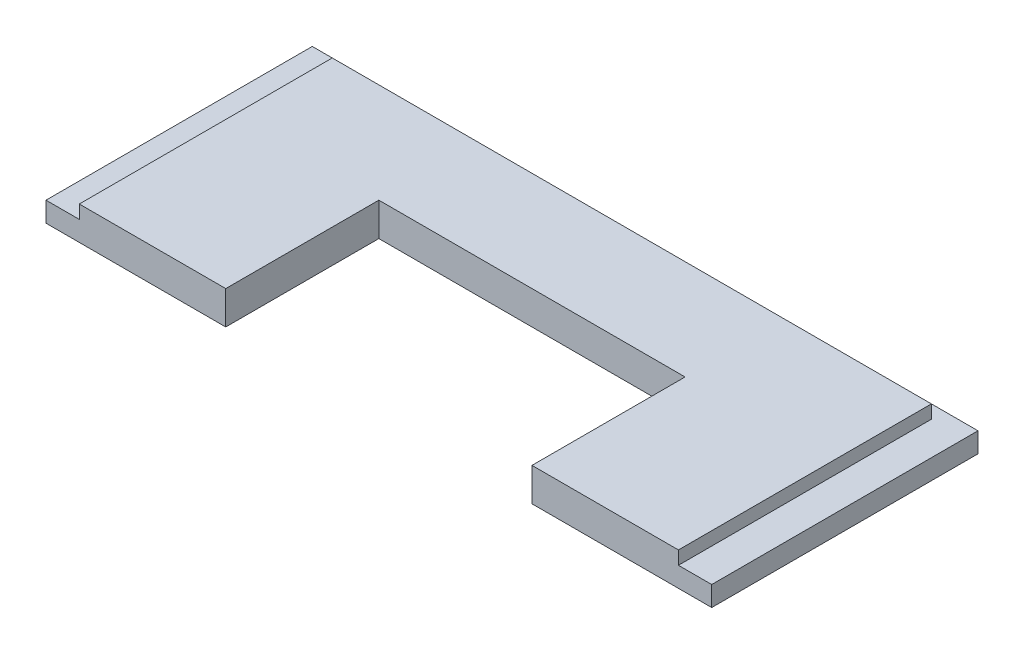
ISO-10303-21;
HEADER;
FILE_DESCRIPTION(('STEP AP214'),'2;1');
FILE_NAME('part.step','',(''),(''),'','','');
FILE_SCHEMA(('AUTOMOTIVE_DESIGN { 1 0 10303 214 1 1 1 1 }'));
ENDSEC;
DATA;
#1=APPLICATION_CONTEXT('core data for automotive mechanical design processes');
#2=APPLICATION_PROTOCOL_DEFINITION('international standard','automotive_design',2000,#1);
#3=PRODUCT_CONTEXT('',#1,'mechanical');
#4=PRODUCT('Part','Part','',(#3));
#5=PRODUCT_RELATED_PRODUCT_CATEGORY('part','',(#4));
#6=PRODUCT_DEFINITION_FORMATION('','',#4);
#7=PRODUCT_DEFINITION_CONTEXT('part definition',#1,'design');
#8=PRODUCT_DEFINITION('design','',#6,#7);
#9=PRODUCT_DEFINITION_SHAPE('','',#8);
#10=(LENGTH_UNIT() NAMED_UNIT(*) SI_UNIT(.MILLI.,.METRE.));
#11=(NAMED_UNIT(*) PLANE_ANGLE_UNIT() SI_UNIT($,.RADIAN.));
#12=(NAMED_UNIT(*) SI_UNIT($,.STERADIAN.) SOLID_ANGLE_UNIT());
#13=UNCERTAINTY_MEASURE_WITH_UNIT(LENGTH_MEASURE(1.E-05),#10,'distance_accuracy_value','');
#14=(GEOMETRIC_REPRESENTATION_CONTEXT(3) GLOBAL_UNCERTAINTY_ASSIGNED_CONTEXT((#13)) GLOBAL_UNIT_ASSIGNED_CONTEXT((#10,
#11,#12)) REPRESENTATION_CONTEXT('',''));
#15=CARTESIAN_POINT('',(0.,0.,0.));
#16=DIRECTION('',(0.,0.,1.));
#17=DIRECTION('',(1.,0.,0.));
#18=AXIS2_PLACEMENT_3D('',#15,#16,#17);
#19=CARTESIAN_POINT('',(0.,5.,0.));
#20=DIRECTION('',(0.,0.,1.));
#21=DIRECTION('',(1.,0.,0.));
#22=AXIS2_PLACEMENT_3D('',#19,#20,#21);
#23=PLANE('',#22);
#24=DIRECTION('',(1.,0.,0.));
#25=VECTOR('',#24,1.);
#26=CARTESIAN_POINT('',(0.,3.,0.));
#27=LINE('',#26,#25);
#28=CARTESIAN_POINT('',(-5.,3.,0.));
#29=VERTEX_POINT('',#28);
#30=CARTESIAN_POINT('',(0.,3.,0.));
#31=VERTEX_POINT('',#30);
#32=EDGE_CURVE('E232',#29,#31,#27,.T.);
#33=ORIENTED_EDGE('',*,*,#32,.F.);
#34=DIRECTION('',(0.,1.,0.));
#35=VECTOR('',#34,1.);
#36=CARTESIAN_POINT('',(-5.,3.,0.));
#37=LINE('',#36,#35);
#38=CARTESIAN_POINT('',(-5.,5.,0.));
#39=VERTEX_POINT('',#38);
#40=EDGE_CURVE('E175',#29,#39,#37,.T.);
#41=ORIENTED_EDGE('',*,*,#40,.T.);
#42=DIRECTION('',(-1.,0.,0.));
#43=VECTOR('',#42,1.);
#44=CARTESIAN_POINT('',(0.,5.,0.));
#45=LINE('',#44,#43);
#46=CARTESIAN_POINT('',(-27.,5.,0.));
#47=VERTEX_POINT('',#46);
#48=EDGE_CURVE('E100',#39,#47,#45,.T.);
#49=ORIENTED_EDGE('',*,*,#48,.T.);
#50=DIRECTION('',(0.,-1.,0.));
#51=VECTOR('',#50,1.);
#52=CARTESIAN_POINT('',(-27.,5.,0.));
#53=LINE('',#52,#51);
#54=CARTESIAN_POINT('',(-27.,0.,0.));
#55=VERTEX_POINT('',#54);
#56=EDGE_CURVE('E11',#47,#55,#53,.T.);
#57=ORIENTED_EDGE('',*,*,#56,.T.);
#58=DIRECTION('',(-1.,0.,0.));
#59=VECTOR('',#58,1.);
#60=CARTESIAN_POINT('',(0.,0.,0.));
#61=LINE('',#60,#59);
#62=CARTESIAN_POINT('',(0.,0.,0.));
#63=VERTEX_POINT('',#62);
#64=EDGE_CURVE('E174',#63,#55,#61,.T.);
#65=ORIENTED_EDGE('',*,*,#64,.F.);
#66=DIRECTION('',(0.,-1.,0.));
#67=VECTOR('',#66,1.);
#68=CARTESIAN_POINT('',(0.,5.,0.));
#69=LINE('',#68,#67);
#70=EDGE_CURVE('E45',#31,#63,#69,.T.);
#71=ORIENTED_EDGE('',*,*,#70,.F.);
#72=EDGE_LOOP('',(#33,#41,#49,#57,#65,#71));
#73=FACE_BOUND('',#72,.T.);
#74=ADVANCED_FACE('F37',(#73),#23,.T.);
#75=CARTESIAN_POINT('',(0.,5.,0.));
#76=DIRECTION('',(-1.,0.,0.));
#77=DIRECTION('',(0.,0.,1.));
#78=AXIS2_PLACEMENT_3D('',#75,#76,#77);
#79=PLANE('',#78);
#80=DIRECTION('',(0.,0.,-1.));
#81=VECTOR('',#80,1.);
#82=CARTESIAN_POINT('',(0.,3.,0.));
#83=LINE('',#82,#81);
#84=CARTESIAN_POINT('',(0.,3.,-40.));
#85=VERTEX_POINT('',#84);
#86=EDGE_CURVE('E209',#31,#85,#83,.T.);
#87=ORIENTED_EDGE('',*,*,#86,.F.);
#88=ORIENTED_EDGE('',*,*,#70,.T.);
#89=DIRECTION('',(0.,0.,-1.));
#90=VECTOR('',#89,1.);
#91=CARTESIAN_POINT('',(0.,0.,0.));
#92=LINE('',#91,#90);
#93=CARTESIAN_POINT('',(0.,0.,-40.));
#94=VERTEX_POINT('',#93);
#95=EDGE_CURVE('E178',#63,#94,#92,.T.);
#96=ORIENTED_EDGE('',*,*,#95,.T.);
#97=DIRECTION('',(0.,-1.,0.));
#98=VECTOR('',#97,1.);
#99=CARTESIAN_POINT('',(0.,5.,-40.));
#100=LINE('',#99,#98);
#101=EDGE_CURVE('E201',#85,#94,#100,.T.);
#102=ORIENTED_EDGE('',*,*,#101,.F.);
#103=EDGE_LOOP('',(#87,#88,#96,#102));
#104=FACE_BOUND('',#103,.T.);
#105=ADVANCED_FACE('F206',(#104),#79,.F.);
#106=CARTESIAN_POINT('',(0.,5.,-40.));
#107=DIRECTION('',(0.,0.,1.));
#108=DIRECTION('',(1.,0.,0.));
#109=AXIS2_PLACEMENT_3D('',#106,#107,#108);
#110=PLANE('',#109);
#111=DIRECTION('',(-1.,0.,0.));
#112=VECTOR('',#111,1.);
#113=CARTESIAN_POINT('',(0.,3.,-40.));
#114=LINE('',#113,#112);
#115=CARTESIAN_POINT('',(-100.,3.,-40.));
#116=VERTEX_POINT('',#115);
#117=EDGE_CURVE('E160',#85,#116,#114,.T.);
#118=ORIENTED_EDGE('',*,*,#117,.F.);
#119=ORIENTED_EDGE('',*,*,#101,.T.);
#120=DIRECTION('',(-1.,0.,0.));
#121=VECTOR('',#120,1.);
#122=CARTESIAN_POINT('',(0.,0.,-40.));
#123=LINE('',#122,#121);
#124=CARTESIAN_POINT('',(-100.,0.,-40.));
#125=VERTEX_POINT('',#124);
#126=EDGE_CURVE('E182',#94,#125,#123,.T.);
#127=ORIENTED_EDGE('',*,*,#126,.T.);
#128=DIRECTION('',(0.,-1.,0.));
#129=VECTOR('',#128,1.);
#130=CARTESIAN_POINT('',(-100.,5.,-40.));
#131=LINE('',#130,#129);
#132=EDGE_CURVE('E199',#116,#125,#131,.T.);
#133=ORIENTED_EDGE('',*,*,#132,.F.);
#134=EDGE_LOOP('',(#118,#119,#127,#133));
#135=FACE_BOUND('',#134,.T.);
#136=ADVANCED_FACE('F230',(#135),#110,.F.);
#137=CARTESIAN_POINT('',(-100.,5.,0.));
#138=DIRECTION('',(-1.,0.,0.));
#139=DIRECTION('',(0.,0.,1.));
#140=AXIS2_PLACEMENT_3D('',#137,#138,#139);
#141=PLANE('',#140);
#142=DIRECTION('',(0.,-1.,0.));
#143=VECTOR('',#142,1.);
#144=CARTESIAN_POINT('',(-100.,5.,0.));
#145=LINE('',#144,#143);
#146=CARTESIAN_POINT('',(-100.,3.,0.));
#147=VERTEX_POINT('',#146);
#148=CARTESIAN_POINT('',(-100.,0.,0.));
#149=VERTEX_POINT('',#148);
#150=EDGE_CURVE('E197',#147,#149,#145,.T.);
#151=ORIENTED_EDGE('',*,*,#150,.F.);
#152=DIRECTION('',(0.,0.,1.));
#153=VECTOR('',#152,1.);
#154=CARTESIAN_POINT('',(-100.,3.,0.));
#155=LINE('',#154,#153);
#156=EDGE_CURVE('E148',#116,#147,#155,.T.);
#157=ORIENTED_EDGE('',*,*,#156,.F.);
#158=ORIENTED_EDGE('',*,*,#132,.T.);
#159=DIRECTION('',(0.,0.,-1.));
#160=VECTOR('',#159,1.);
#161=CARTESIAN_POINT('',(-100.,0.,0.));
#162=LINE('',#161,#160);
#163=EDGE_CURVE('E185',#149,#125,#162,.T.);
#164=ORIENTED_EDGE('',*,*,#163,.F.);
#165=EDGE_LOOP('',(#151,#157,#158,#164));
#166=FACE_BOUND('',#165,.T.);
#167=ADVANCED_FACE('F226',(#166),#141,.T.);
#168=CARTESIAN_POINT('',(0.,5.,0.));
#169=DIRECTION('',(0.,1.,0.));
#170=DIRECTION('',(0.,0.,1.));
#171=AXIS2_PLACEMENT_3D('',#168,#169,#170);
#172=PLANE('',#171);
#173=ORIENTED_EDGE('',*,*,#48,.F.);
#174=DIRECTION('',(0.,0.,-1.));
#175=VECTOR('',#174,1.);
#176=CARTESIAN_POINT('',(-5.,5.,0.));
#177=LINE('',#176,#175);
#178=CARTESIAN_POINT('',(-5.,5.,-38.));
#179=VERTEX_POINT('',#178);
#180=EDGE_CURVE('E151',#39,#179,#177,.T.);
#181=ORIENTED_EDGE('',*,*,#180,.T.);
#182=DIRECTION('',(1.,0.,0.));
#183=VECTOR('',#182,1.);
#184=CARTESIAN_POINT('',(0.,5.,-38.));
#185=LINE('',#184,#183);
#186=CARTESIAN_POINT('',(-95.,5.,-38.));
#187=VERTEX_POINT('',#186);
#188=EDGE_CURVE('E238',#187,#179,#185,.T.);
#189=ORIENTED_EDGE('',*,*,#188,.F.);
#190=DIRECTION('',(0.,0.,-1.));
#191=VECTOR('',#190,1.);
#192=CARTESIAN_POINT('',(-95.,5.,0.));
#193=LINE('',#192,#191);
#194=CARTESIAN_POINT('',(-95.,5.,0.));
#195=VERTEX_POINT('',#194);
#196=EDGE_CURVE('E236',#195,#187,#193,.T.);
#197=ORIENTED_EDGE('',*,*,#196,.F.);
#198=CARTESIAN_POINT('',(-73.,5.,0.));
#199=VERTEX_POINT('',#198);
#200=EDGE_CURVE('E156',#199,#195,#45,.T.);
#201=ORIENTED_EDGE('',*,*,#200,.F.);
#202=DIRECTION('',(0.,0.,-1.));
#203=VECTOR('',#202,1.);
#204=CARTESIAN_POINT('',(-73.,5.,0.));
#205=LINE('',#204,#203);
#206=CARTESIAN_POINT('',(-73.,5.,-23.));
#207=VERTEX_POINT('',#206);
#208=EDGE_CURVE('E168',#199,#207,#205,.T.);
#209=ORIENTED_EDGE('',*,*,#208,.T.);
#210=DIRECTION('',(1.,0.,0.));
#211=VECTOR('',#210,1.);
#212=CARTESIAN_POINT('',(0.,5.,-23.));
#213=LINE('',#212,#211);
#214=CARTESIAN_POINT('',(-27.,5.,-23.));
#215=VERTEX_POINT('',#214);
#216=EDGE_CURVE('E61',#207,#215,#213,.T.);
#217=ORIENTED_EDGE('',*,*,#216,.T.);
#218=DIRECTION('',(0.,0.,-1.));
#219=VECTOR('',#218,1.);
#220=CARTESIAN_POINT('',(-27.,5.,0.));
#221=LINE('',#220,#219);
#222=EDGE_CURVE('E164',#47,#215,#221,.T.);
#223=ORIENTED_EDGE('',*,*,#222,.F.);
#224=EDGE_LOOP('',(#173,#181,#189,#197,#201,#209,#217,#223));
#225=FACE_BOUND('',#224,.T.);
#226=ADVANCED_FACE('F251',(#225),#172,.T.);
#227=CARTESIAN_POINT('',(-27.,5.,0.));
#228=DIRECTION('',(-1.,0.,0.));
#229=DIRECTION('',(0.,0.,1.));
#230=AXIS2_PLACEMENT_3D('',#227,#228,#229);
#231=PLANE('',#230);
#232=DIRECTION('',(0.,0.,-1.));
#233=VECTOR('',#232,1.);
#234=CARTESIAN_POINT('',(-27.,0.,0.));
#235=LINE('',#234,#233);
#236=CARTESIAN_POINT('',(-27.,0.,-23.));
#237=VERTEX_POINT('',#236);
#238=EDGE_CURVE('E171',#55,#237,#235,.T.);
#239=ORIENTED_EDGE('',*,*,#238,.F.);
#240=ORIENTED_EDGE('',*,*,#56,.F.);
#241=ORIENTED_EDGE('',*,*,#222,.T.);
#242=DIRECTION('',(0.,-1.,0.));
#243=VECTOR('',#242,1.);
#244=CARTESIAN_POINT('',(-27.,5.,-23.));
#245=LINE('',#244,#243);
#246=EDGE_CURVE('E93',#215,#237,#245,.T.);
#247=ORIENTED_EDGE('',*,*,#246,.T.);
#248=EDGE_LOOP('',(#239,#240,#241,#247));
#249=FACE_BOUND('',#248,.T.);
#250=ADVANCED_FACE('F39',(#249),#231,.T.);
#251=DIRECTION('',(0.,1.,0.));
#252=VECTOR('',#251,1.);
#253=CARTESIAN_POINT('',(-95.,3.,0.));
#254=LINE('',#253,#252);
#255=CARTESIAN_POINT('',(-95.,3.,0.));
#256=VERTEX_POINT('',#255);
#257=EDGE_CURVE('E52',#256,#195,#254,.T.);
#258=ORIENTED_EDGE('',*,*,#257,.F.);
#259=DIRECTION('',(1.,0.,0.));
#260=VECTOR('',#259,1.);
#261=CARTESIAN_POINT('',(0.,3.,0.));
#262=LINE('',#261,#260);
#263=EDGE_CURVE('E143',#147,#256,#262,.T.);
#264=ORIENTED_EDGE('',*,*,#263,.F.);
#265=ORIENTED_EDGE('',*,*,#150,.T.);
#266=CARTESIAN_POINT('',(-73.,0.,0.));
#267=VERTEX_POINT('',#266);
#268=EDGE_CURVE('E179',#267,#149,#61,.T.);
#269=ORIENTED_EDGE('',*,*,#268,.F.);
#270=DIRECTION('',(0.,-1.,0.));
#271=VECTOR('',#270,1.);
#272=CARTESIAN_POINT('',(-73.,5.,0.));
#273=LINE('',#272,#271);
#274=EDGE_CURVE('E195',#199,#267,#273,.T.);
#275=ORIENTED_EDGE('',*,*,#274,.F.);
#276=ORIENTED_EDGE('',*,*,#200,.T.);
#277=EDGE_LOOP('',(#258,#264,#265,#269,#275,#276));
#278=FACE_BOUND('',#277,.T.);
#279=ADVANCED_FACE('F154',(#278),#23,.T.);
#280=CARTESIAN_POINT('',(-73.,5.,0.));
#281=DIRECTION('',(-1.,0.,0.));
#282=DIRECTION('',(0.,0.,1.));
#283=AXIS2_PLACEMENT_3D('',#280,#281,#282);
#284=PLANE('',#283);
#285=DIRECTION('',(0.,0.,-1.));
#286=VECTOR('',#285,1.);
#287=CARTESIAN_POINT('',(-73.,0.,0.));
#288=LINE('',#287,#286);
#289=CARTESIAN_POINT('',(-73.,0.,-23.));
#290=VERTEX_POINT('',#289);
#291=EDGE_CURVE('E188',#267,#290,#288,.T.);
#292=ORIENTED_EDGE('',*,*,#291,.T.);
#293=DIRECTION('',(0.,-1.,0.));
#294=VECTOR('',#293,1.);
#295=CARTESIAN_POINT('',(-73.,5.,-23.));
#296=LINE('',#295,#294);
#297=EDGE_CURVE('E192',#207,#290,#296,.T.);
#298=ORIENTED_EDGE('',*,*,#297,.F.);
#299=ORIENTED_EDGE('',*,*,#208,.F.);
#300=ORIENTED_EDGE('',*,*,#274,.T.);
#301=EDGE_LOOP('',(#292,#298,#299,#300));
#302=FACE_BOUND('',#301,.T.);
#303=ADVANCED_FACE('F223',(#302),#284,.F.);
#304=CARTESIAN_POINT('',(0.,5.,-23.));
#305=DIRECTION('',(0.,0.,-1.));
#306=DIRECTION('',(-1.,0.,0.));
#307=AXIS2_PLACEMENT_3D('',#304,#305,#306);
#308=PLANE('',#307);
#309=DIRECTION('',(1.,0.,0.));
#310=VECTOR('',#309,1.);
#311=CARTESIAN_POINT('',(0.,0.,-23.));
#312=LINE('',#311,#310);
#313=EDGE_CURVE('E166',#290,#237,#312,.T.);
#314=ORIENTED_EDGE('',*,*,#313,.T.);
#315=ORIENTED_EDGE('',*,*,#246,.F.);
#316=ORIENTED_EDGE('',*,*,#216,.F.);
#317=ORIENTED_EDGE('',*,*,#297,.T.);
#318=EDGE_LOOP('',(#314,#315,#316,#317));
#319=FACE_BOUND('',#318,.T.);
#320=ADVANCED_FACE('F219',(#319),#308,.F.);
#321=CARTESIAN_POINT('',(0.,0.,0.));
#322=DIRECTION('',(0.,1.,0.));
#323=DIRECTION('',(0.,0.,1.));
#324=AXIS2_PLACEMENT_3D('',#321,#322,#323);
#325=PLANE('',#324);
#326=ORIENTED_EDGE('',*,*,#238,.T.);
#327=ORIENTED_EDGE('',*,*,#313,.F.);
#328=ORIENTED_EDGE('',*,*,#291,.F.);
#329=ORIENTED_EDGE('',*,*,#268,.T.);
#330=ORIENTED_EDGE('',*,*,#163,.T.);
#331=ORIENTED_EDGE('',*,*,#126,.F.);
#332=ORIENTED_EDGE('',*,*,#95,.F.);
#333=ORIENTED_EDGE('',*,*,#64,.T.);
#334=EDGE_LOOP('',(#326,#327,#328,#329,#330,#331,#332,#333));
#335=FACE_BOUND('',#334,.T.);
#336=ADVANCED_FACE('F213',(#335),#325,.F.);
#337=CARTESIAN_POINT('',(-5.,3.,0.));
#338=DIRECTION('',(1.,0.,0.));
#339=DIRECTION('',(0.,0.,-1.));
#340=AXIS2_PLACEMENT_3D('',#337,#338,#339);
#341=PLANE('',#340);
#342=ORIENTED_EDGE('',*,*,#180,.F.);
#343=ORIENTED_EDGE('',*,*,#40,.F.);
#344=DIRECTION('',(0.,0.,-1.));
#345=VECTOR('',#344,1.);
#346=CARTESIAN_POINT('',(-5.,3.,0.));
#347=LINE('',#346,#345);
#348=CARTESIAN_POINT('',(-5.,3.,-38.));
#349=VERTEX_POINT('',#348);
#350=EDGE_CURVE('E247',#29,#349,#347,.T.);
#351=ORIENTED_EDGE('',*,*,#350,.T.);
#352=DIRECTION('',(0.,1.,0.));
#353=VECTOR('',#352,1.);
#354=CARTESIAN_POINT('',(-5.,3.,-38.));
#355=LINE('',#354,#353);
#356=EDGE_CURVE('E158',#349,#179,#355,.T.);
#357=ORIENTED_EDGE('',*,*,#356,.T.);
#358=EDGE_LOOP('',(#342,#343,#351,#357));
#359=FACE_BOUND('',#358,.T.);
#360=ADVANCED_FACE('F245',(#359),#341,.T.);
#361=CARTESIAN_POINT('',(0.,3.,-38.));
#362=DIRECTION('',(0.,0.,1.));
#363=DIRECTION('',(1.,0.,0.));
#364=AXIS2_PLACEMENT_3D('',#361,#362,#363);
#365=PLANE('',#364);
#366=ORIENTED_EDGE('',*,*,#188,.T.);
#367=ORIENTED_EDGE('',*,*,#356,.F.);
#368=DIRECTION('',(1.,0.,0.));
#369=VECTOR('',#368,1.);
#370=CARTESIAN_POINT('',(0.,3.,-38.));
#371=LINE('',#370,#369);
#372=CARTESIAN_POINT('',(-95.,3.,-38.));
#373=VERTEX_POINT('',#372);
#374=EDGE_CURVE('E142',#373,#349,#371,.T.);
#375=ORIENTED_EDGE('',*,*,#374,.F.);
#376=DIRECTION('',(0.,1.,0.));
#377=VECTOR('',#376,1.);
#378=CARTESIAN_POINT('',(-95.,3.,-38.));
#379=LINE('',#378,#377);
#380=EDGE_CURVE('E138',#373,#187,#379,.T.);
#381=ORIENTED_EDGE('',*,*,#380,.T.);
#382=EDGE_LOOP('',(#366,#367,#375,#381));
#383=FACE_BOUND('',#382,.T.);
#384=ADVANCED_FACE('F250',(#383),#365,.F.);
#385=CARTESIAN_POINT('',(-95.,3.,0.));
#386=DIRECTION('',(1.,0.,0.));
#387=DIRECTION('',(0.,0.,-1.));
#388=AXIS2_PLACEMENT_3D('',#385,#386,#387);
#389=PLANE('',#388);
#390=ORIENTED_EDGE('',*,*,#196,.T.);
#391=ORIENTED_EDGE('',*,*,#380,.F.);
#392=DIRECTION('',(0.,0.,-1.));
#393=VECTOR('',#392,1.);
#394=CARTESIAN_POINT('',(-95.,3.,0.));
#395=LINE('',#394,#393);
#396=EDGE_CURVE('E135',#256,#373,#395,.T.);
#397=ORIENTED_EDGE('',*,*,#396,.F.);
#398=ORIENTED_EDGE('',*,*,#257,.T.);
#399=EDGE_LOOP('',(#390,#391,#397,#398));
#400=FACE_BOUND('',#399,.T.);
#401=ADVANCED_FACE('F137',(#400),#389,.F.);
#402=CARTESIAN_POINT('',(0.,3.,0.));
#403=DIRECTION('',(0.,1.,0.));
#404=DIRECTION('',(0.,0.,1.));
#405=AXIS2_PLACEMENT_3D('',#402,#403,#404);
#406=PLANE('',#405);
#407=ORIENTED_EDGE('',*,*,#263,.T.);
#408=ORIENTED_EDGE('',*,*,#396,.T.);
#409=ORIENTED_EDGE('',*,*,#374,.T.);
#410=ORIENTED_EDGE('',*,*,#350,.F.);
#411=ORIENTED_EDGE('',*,*,#32,.T.);
#412=ORIENTED_EDGE('',*,*,#86,.T.);
#413=ORIENTED_EDGE('',*,*,#117,.T.);
#414=ORIENTED_EDGE('',*,*,#156,.T.);
#415=EDGE_LOOP('',(#407,#408,#409,#410,#411,#412,#413,#414));
#416=FACE_BOUND('',#415,.T.);
#417=ADVANCED_FACE('F146',(#416),#406,.T.);
#418=CLOSED_SHELL('',(#74,#105,#136,#167,#226,#250,#279,#303,#320,#336,#360,#384,#401,#417));
#419=MANIFOLD_SOLID_BREP('B2',#418);
#420=ADVANCED_BREP_SHAPE_REPRESENTATION('',(#18,#419),#14);
#421=SHAPE_DEFINITION_REPRESENTATION(#9,#420);
ENDSEC;
END-ISO-10303-21;
